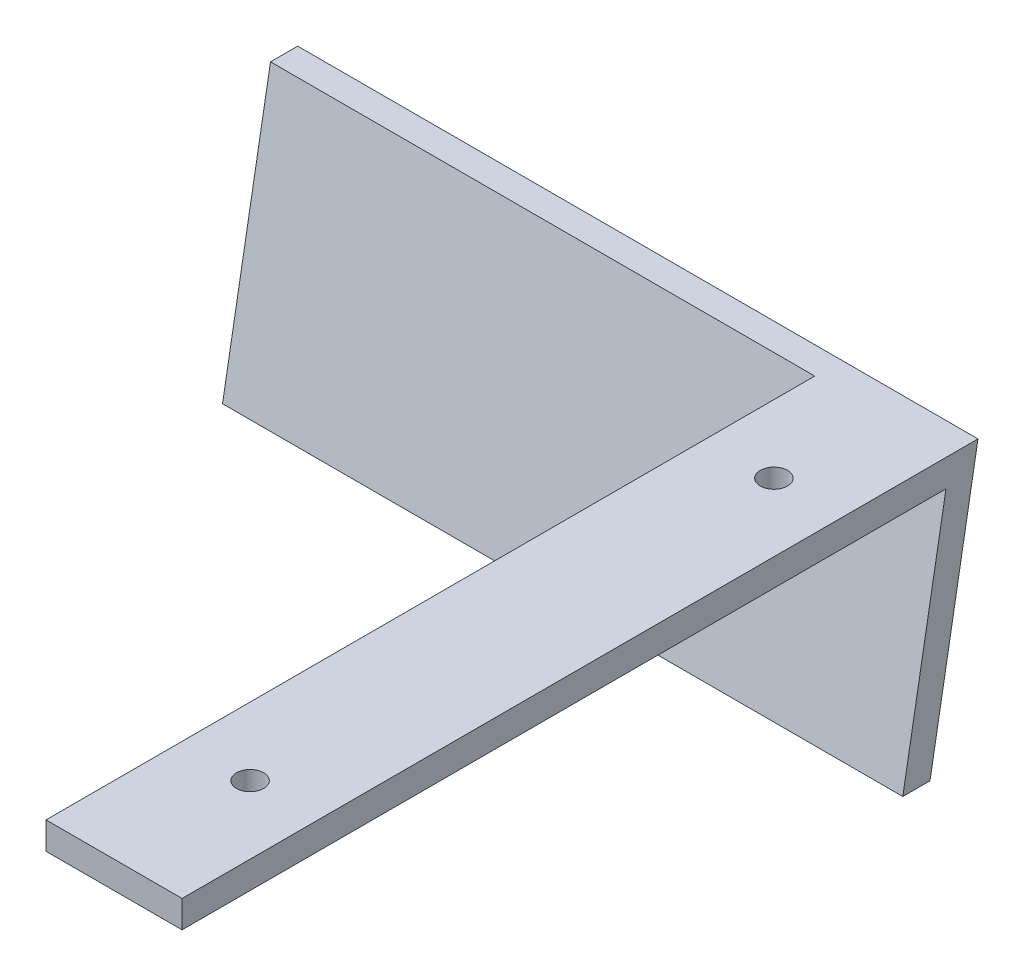
ISO-10303-21;
HEADER;
FILE_DESCRIPTION(('STEP AP214'),'2;1');
FILE_NAME('part.step','',(''),(''),'','','');
FILE_SCHEMA(('AUTOMOTIVE_DESIGN { 1 0 10303 214 1 1 1 1 }'));
ENDSEC;
DATA;
#1=APPLICATION_CONTEXT('core data for automotive mechanical design processes');
#2=APPLICATION_PROTOCOL_DEFINITION('international standard','automotive_design',2000,#1);
#3=PRODUCT_CONTEXT('',#1,'mechanical');
#4=PRODUCT('Part','Part','',(#3));
#5=PRODUCT_RELATED_PRODUCT_CATEGORY('part','',(#4));
#6=PRODUCT_DEFINITION_FORMATION('','',#4);
#7=PRODUCT_DEFINITION_CONTEXT('part definition',#1,'design');
#8=PRODUCT_DEFINITION('design','',#6,#7);
#9=PRODUCT_DEFINITION_SHAPE('','',#8);
#10=(LENGTH_UNIT() NAMED_UNIT(*) SI_UNIT(.MILLI.,.METRE.));
#11=(NAMED_UNIT(*) PLANE_ANGLE_UNIT() SI_UNIT($,.RADIAN.));
#12=(NAMED_UNIT(*) SI_UNIT($,.STERADIAN.) SOLID_ANGLE_UNIT());
#13=UNCERTAINTY_MEASURE_WITH_UNIT(LENGTH_MEASURE(1.E-05),#10,'distance_accuracy_value','');
#14=(GEOMETRIC_REPRESENTATION_CONTEXT(3) GLOBAL_UNCERTAINTY_ASSIGNED_CONTEXT((#13)) GLOBAL_UNIT_ASSIGNED_CONTEXT((#10,
#11,#12)) REPRESENTATION_CONTEXT('',''));
#15=CARTESIAN_POINT('',(0.,0.,0.));
#16=DIRECTION('',(0.,0.,1.));
#17=DIRECTION('',(1.,0.,0.));
#18=AXIS2_PLACEMENT_3D('',#15,#16,#17);
#19=CARTESIAN_POINT('',(-10.,18.,0.));
#20=DIRECTION('',(0.,-1.,0.));
#21=DIRECTION('',(0.,0.,-1.));
#22=AXIS2_PLACEMENT_3D('',#19,#20,#21);
#23=PLANE('',#22);
#24=CARTESIAN_POINT('',(-5.,18.,42.9734603858306));
#25=DIRECTION('',(0.,1.,0.));
#26=DIRECTION('',(0.,0.,-1.));
#27=AXIS2_PLACEMENT_3D('',#24,#25,#26);
#28=CIRCLE('',#27,1.);
#29=CARTESIAN_POINT('',(-5.,18.,41.9734603858306));
#30=VERTEX_POINT('',#29);
#31=EDGE_CURVE('E136',#30,#30,#28,.T.);
#32=ORIENTED_EDGE('',*,*,#31,.T.);
#33=EDGE_LOOP('',(#32));
#34=FACE_BOUND('',#33,.T.);
#35=CARTESIAN_POINT('',(-5.,18.,4.47346038583062));
#36=DIRECTION('',(0.,1.,0.));
#37=DIRECTION('',(0.,0.,-1.));
#38=AXIS2_PLACEMENT_3D('',#35,#36,#37);
#39=CIRCLE('',#38,1.);
#40=CARTESIAN_POINT('',(-5.,18.,3.47346038583062));
#41=VERTEX_POINT('',#40);
#42=EDGE_CURVE('E195',#41,#41,#39,.T.);
#43=ORIENTED_EDGE('',*,*,#42,.T.);
#44=EDGE_LOOP('',(#43));
#45=FACE_BOUND('',#44,.T.);
#46=DIRECTION('',(0.,0.,1.));
#47=VECTOR('',#46,1.);
#48=CARTESIAN_POINT('',(0.,18.,0.));
#49=LINE('',#48,#47);
#50=CARTESIAN_POINT('',(0.,18.,-3.17388565275244));
#51=VERTEX_POINT('',#50);
#52=CARTESIAN_POINT('',(0.,18.,52.9734603858306));
#53=VERTEX_POINT('',#52);
#54=EDGE_CURVE('E124',#51,#53,#49,.T.);
#55=ORIENTED_EDGE('',*,*,#54,.T.);
#56=DIRECTION('',(1.,0.,0.));
#57=VECTOR('',#56,1.);
#58=CARTESIAN_POINT('',(-10.,18.,52.9734603858306));
#59=LINE('',#58,#57);
#60=CARTESIAN_POINT('',(-10.,18.,52.9734603858306));
#61=VERTEX_POINT('',#60);
#62=EDGE_CURVE('E156',#61,#53,#59,.T.);
#63=ORIENTED_EDGE('',*,*,#62,.F.);
#64=DIRECTION('',(0.,0.,1.));
#65=VECTOR('',#64,1.);
#66=CARTESIAN_POINT('',(-10.,18.,0.));
#67=LINE('',#66,#65);
#68=CARTESIAN_POINT('',(-10.,18.,-3.17388565275244));
#69=VERTEX_POINT('',#68);
#70=EDGE_CURVE('E150',#69,#61,#67,.T.);
#71=ORIENTED_EDGE('',*,*,#70,.F.);
#72=DIRECTION('',(1.,0.,0.));
#73=VECTOR('',#72,1.);
#74=CARTESIAN_POINT('',(-10.,18.,-3.17388565275244));
#75=LINE('',#74,#73);
#76=EDGE_CURVE('E11',#69,#51,#75,.T.);
#77=ORIENTED_EDGE('',*,*,#76,.T.);
#78=EDGE_LOOP('',(#55,#63,#71,#77));
#79=FACE_BOUND('',#78,.T.);
#80=ADVANCED_FACE('F43',(#34,#45,#79),#23,.T.);
#81=CARTESIAN_POINT('',(-10.,20.,0.));
#82=DIRECTION('',(0.,1.,0.));
#83=DIRECTION('',(0.,0.,1.));
#84=AXIS2_PLACEMENT_3D('',#81,#82,#83);
#85=PLANE('',#84);
#86=CARTESIAN_POINT('',(-5.,20.,42.9734603858306));
#87=DIRECTION('',(0.,-1.,0.));
#88=DIRECTION('',(0.,0.,1.));
#89=AXIS2_PLACEMENT_3D('',#86,#87,#88);
#90=CIRCLE('',#89,1.);
#91=CARTESIAN_POINT('',(-5.,20.,43.9734603858306));
#92=VERTEX_POINT('',#91);
#93=EDGE_CURVE('E275',#92,#92,#90,.T.);
#94=ORIENTED_EDGE('',*,*,#93,.T.);
#95=EDGE_LOOP('',(#94));
#96=FACE_BOUND('',#95,.T.);
#97=CARTESIAN_POINT('',(-5.,20.,4.47346038583062));
#98=DIRECTION('',(0.,-1.,0.));
#99=DIRECTION('',(0.,0.,1.));
#100=AXIS2_PLACEMENT_3D('',#97,#98,#99);
#101=CIRCLE('',#100,1.);
#102=CARTESIAN_POINT('',(-5.,20.,5.47346038583062));
#103=VERTEX_POINT('',#102);
#104=EDGE_CURVE('E276',#103,#103,#101,.T.);
#105=ORIENTED_EDGE('',*,*,#104,.T.);
#106=EDGE_LOOP('',(#105));
#107=FACE_BOUND('',#106,.T.);
#108=DIRECTION('',(0.,0.,-1.));
#109=VECTOR('',#108,1.);
#110=CARTESIAN_POINT('',(0.,20.,0.));
#111=LINE('',#110,#109);
#112=CARTESIAN_POINT('',(0.,20.,52.9734603858306));
#113=VERTEX_POINT('',#112);
#114=CARTESIAN_POINT('',(0.,20.,-5.52653961416938));
#115=VERTEX_POINT('',#114);
#116=EDGE_CURVE('E159',#113,#115,#111,.T.);
#117=ORIENTED_EDGE('',*,*,#116,.T.);
#118=DIRECTION('',(1.,0.,0.));
#119=VECTOR('',#118,1.);
#120=CARTESIAN_POINT('',(-50.,20.,-5.52653961416938));
#121=LINE('',#120,#119);
#122=CARTESIAN_POINT('',(-50.,20.,-5.52653961416938));
#123=VERTEX_POINT('',#122);
#124=EDGE_CURVE('E146',#123,#115,#121,.T.);
#125=ORIENTED_EDGE('',*,*,#124,.F.);
#126=DIRECTION('',(0.,0.,-1.));
#127=VECTOR('',#126,1.);
#128=CARTESIAN_POINT('',(-50.,20.,0.));
#129=LINE('',#128,#127);
#130=CARTESIAN_POINT('',(-50.,20.,-3.52653961416938));
#131=VERTEX_POINT('',#130);
#132=EDGE_CURVE('E140',#131,#123,#129,.T.);
#133=ORIENTED_EDGE('',*,*,#132,.F.);
#134=DIRECTION('',(1.,0.,0.));
#135=VECTOR('',#134,1.);
#136=CARTESIAN_POINT('',(-50.,20.,-3.52653961416938));
#137=LINE('',#136,#135);
#138=CARTESIAN_POINT('',(-10.,20.,-3.52653961416938));
#139=VERTEX_POINT('',#138);
#140=EDGE_CURVE('E129',#131,#139,#137,.T.);
#141=ORIENTED_EDGE('',*,*,#140,.T.);
#142=DIRECTION('',(0.,0.,-1.));
#143=VECTOR('',#142,1.);
#144=CARTESIAN_POINT('',(-10.,20.,0.));
#145=LINE('',#144,#143);
#146=CARTESIAN_POINT('',(-10.,20.,52.9734603858306));
#147=VERTEX_POINT('',#146);
#148=EDGE_CURVE('E153',#147,#139,#145,.T.);
#149=ORIENTED_EDGE('',*,*,#148,.F.);
#150=DIRECTION('',(1.,0.,0.));
#151=VECTOR('',#150,1.);
#152=CARTESIAN_POINT('',(-10.,20.,52.9734603858306));
#153=LINE('',#152,#151);
#154=EDGE_CURVE('E51',#147,#113,#153,.T.);
#155=ORIENTED_EDGE('',*,*,#154,.T.);
#156=EDGE_LOOP('',(#117,#125,#133,#141,#149,#155));
#157=FACE_BOUND('',#156,.T.);
#158=ADVANCED_FACE('F165',(#96,#107,#157),#85,.T.);
#159=CARTESIAN_POINT('',(-10.,0.,52.9734603858306));
#160=DIRECTION('',(0.,0.,1.));
#161=DIRECTION('',(-1.,0.,0.));
#162=AXIS2_PLACEMENT_3D('',#159,#160,#161);
#163=PLANE('',#162);
#164=DIRECTION('',(0.,1.,0.));
#165=VECTOR('',#164,1.);
#166=CARTESIAN_POINT('',(0.,0.,52.9734603858306));
#167=LINE('',#166,#165);
#168=EDGE_CURVE('E71',#53,#113,#167,.T.);
#169=ORIENTED_EDGE('',*,*,#168,.T.);
#170=ORIENTED_EDGE('',*,*,#154,.F.);
#171=DIRECTION('',(0.,1.,0.));
#172=VECTOR('',#171,1.);
#173=CARTESIAN_POINT('',(-10.,0.,52.9734603858306));
#174=LINE('',#173,#172);
#175=EDGE_CURVE('E59',#61,#147,#174,.T.);
#176=ORIENTED_EDGE('',*,*,#175,.F.);
#177=ORIENTED_EDGE('',*,*,#62,.T.);
#178=EDGE_LOOP('',(#169,#170,#176,#177));
#179=FACE_BOUND('',#178,.T.);
#180=ADVANCED_FACE('F187',(#179),#163,.T.);
#181=CARTESIAN_POINT('',(-10.,0.,0.));
#182=DIRECTION('',(-1.,0.,0.));
#183=DIRECTION('',(0.,0.,-1.));
#184=AXIS2_PLACEMENT_3D('',#181,#182,#183);
#185=PLANE('',#184);
#186=ORIENTED_EDGE('',*,*,#70,.T.);
#187=ORIENTED_EDGE('',*,*,#175,.T.);
#188=ORIENTED_EDGE('',*,*,#148,.T.);
#189=DIRECTION('',(0.,0.984807753012207,-0.173648177666934));
#190=VECTOR('',#189,1.);
#191=CARTESIAN_POINT('',(-10.,0.,0.));
#192=LINE('',#191,#190);
#193=EDGE_CURVE('E82',#69,#139,#192,.T.);
#194=ORIENTED_EDGE('',*,*,#193,.F.);
#195=EDGE_LOOP('',(#186,#187,#188,#194));
#196=FACE_BOUND('',#195,.T.);
#197=ADVANCED_FACE('F198',(#196),#185,.T.);
#198=CARTESIAN_POINT('',(0.,0.,0.));
#199=DIRECTION('',(-1.,0.,0.));
#200=DIRECTION('',(0.,0.,-1.));
#201=AXIS2_PLACEMENT_3D('',#198,#199,#200);
#202=PLANE('',#201);
#203=ORIENTED_EDGE('',*,*,#54,.F.);
#204=DIRECTION('',(0.,0.984807753012207,-0.173648177666934));
#205=VECTOR('',#204,1.);
#206=CARTESIAN_POINT('',(0.,0.,0.));
#207=LINE('',#206,#205);
#208=CARTESIAN_POINT('',(0.,0.,0.));
#209=VERTEX_POINT('',#208);
#210=EDGE_CURVE('E142',#209,#51,#207,.T.);
#211=ORIENTED_EDGE('',*,*,#210,.F.);
#212=DIRECTION('',(0.,0.,1.));
#213=VECTOR('',#212,1.);
#214=CARTESIAN_POINT('',(0.,0.,0.));
#215=LINE('',#214,#213);
#216=CARTESIAN_POINT('',(0.,0.,-2.));
#217=VERTEX_POINT('',#216);
#218=EDGE_CURVE('E121',#217,#209,#215,.T.);
#219=ORIENTED_EDGE('',*,*,#218,.F.);
#220=DIRECTION('',(0.,-0.984807753012208,0.173648177666934));
#221=VECTOR('',#220,1.);
#222=CARTESIAN_POINT('',(0.,-0.342020143325676,-1.93969262078591));
#223=LINE('',#222,#221);
#224=EDGE_CURVE('E131',#115,#217,#223,.T.);
#225=ORIENTED_EDGE('',*,*,#224,.F.);
#226=ORIENTED_EDGE('',*,*,#116,.F.);
#227=ORIENTED_EDGE('',*,*,#168,.F.);
#228=EDGE_LOOP('',(#203,#211,#219,#225,#226,#227));
#229=FACE_BOUND('',#228,.T.);
#230=ADVANCED_FACE('F167',(#229),#202,.F.);
#231=CARTESIAN_POINT('',(-50.,0.,0.));
#232=DIRECTION('',(0.,0.173648177666934,0.984807753012207));
#233=DIRECTION('',(0.,-0.984807753012207,0.173648177666934));
#234=AXIS2_PLACEMENT_3D('',#231,#232,#233);
#235=PLANE('',#234);
#236=ORIENTED_EDGE('',*,*,#193,.T.);
#237=ORIENTED_EDGE('',*,*,#140,.F.);
#238=DIRECTION('',(0.,0.984807753012207,-0.173648177666934));
#239=VECTOR('',#238,1.);
#240=CARTESIAN_POINT('',(-50.,0.,0.));
#241=LINE('',#240,#239);
#242=CARTESIAN_POINT('',(-50.,0.,0.));
#243=VERTEX_POINT('',#242);
#244=EDGE_CURVE('E111',#243,#131,#241,.T.);
#245=ORIENTED_EDGE('',*,*,#244,.F.);
#246=DIRECTION('',(1.,0.,0.));
#247=VECTOR('',#246,1.);
#248=CARTESIAN_POINT('',(-50.,0.,0.));
#249=LINE('',#248,#247);
#250=EDGE_CURVE('E118',#243,#209,#249,.T.);
#251=ORIENTED_EDGE('',*,*,#250,.T.);
#252=ORIENTED_EDGE('',*,*,#210,.T.);
#253=ORIENTED_EDGE('',*,*,#76,.F.);
#254=EDGE_LOOP('',(#236,#237,#245,#251,#252,#253));
#255=FACE_BOUND('',#254,.T.);
#256=ADVANCED_FACE('F127',(#255),#235,.T.);
#257=CARTESIAN_POINT('',(-50.,0.,0.));
#258=DIRECTION('',(0.,-1.,0.));
#259=DIRECTION('',(0.,0.,-1.));
#260=AXIS2_PLACEMENT_3D('',#257,#258,#259);
#261=PLANE('',#260);
#262=ORIENTED_EDGE('',*,*,#218,.T.);
#263=ORIENTED_EDGE('',*,*,#250,.F.);
#264=DIRECTION('',(0.,0.,1.));
#265=VECTOR('',#264,1.);
#266=CARTESIAN_POINT('',(-50.,0.,0.));
#267=LINE('',#266,#265);
#268=CARTESIAN_POINT('',(-50.,0.,-2.));
#269=VERTEX_POINT('',#268);
#270=EDGE_CURVE('E106',#269,#243,#267,.T.);
#271=ORIENTED_EDGE('',*,*,#270,.F.);
#272=DIRECTION('',(1.,0.,0.));
#273=VECTOR('',#272,1.);
#274=CARTESIAN_POINT('',(-50.,0.,-2.));
#275=LINE('',#274,#273);
#276=EDGE_CURVE('E125',#269,#217,#275,.T.);
#277=ORIENTED_EDGE('',*,*,#276,.T.);
#278=EDGE_LOOP('',(#262,#263,#271,#277));
#279=FACE_BOUND('',#278,.T.);
#280=ADVANCED_FACE('F119',(#279),#261,.T.);
#281=CARTESIAN_POINT('',(-50.,-0.342020143325676,-1.93969262078591));
#282=DIRECTION('',(0.,-0.173648177666934,-0.984807753012207));
#283=DIRECTION('',(0.,0.984807753012207,-0.173648177666934));
#284=AXIS2_PLACEMENT_3D('',#281,#282,#283);
#285=PLANE('',#284);
#286=ORIENTED_EDGE('',*,*,#224,.T.);
#287=ORIENTED_EDGE('',*,*,#276,.F.);
#288=DIRECTION('',(0.,-0.984807753012208,0.173648177666934));
#289=VECTOR('',#288,1.);
#290=CARTESIAN_POINT('',(-50.,-0.342020143325676,-1.93969262078591));
#291=LINE('',#290,#289);
#292=EDGE_CURVE('E113',#123,#269,#291,.T.);
#293=ORIENTED_EDGE('',*,*,#292,.F.);
#294=ORIENTED_EDGE('',*,*,#124,.T.);
#295=EDGE_LOOP('',(#286,#287,#293,#294));
#296=FACE_BOUND('',#295,.T.);
#297=ADVANCED_FACE('F169',(#296),#285,.T.);
#298=CARTESIAN_POINT('',(-50.,0.,0.));
#299=DIRECTION('',(-1.,0.,0.));
#300=DIRECTION('',(0.,0.,-1.));
#301=AXIS2_PLACEMENT_3D('',#298,#299,#300);
#302=PLANE('',#301);
#303=ORIENTED_EDGE('',*,*,#244,.T.);
#304=ORIENTED_EDGE('',*,*,#132,.T.);
#305=ORIENTED_EDGE('',*,*,#292,.T.);
#306=ORIENTED_EDGE('',*,*,#270,.T.);
#307=EDGE_LOOP('',(#303,#304,#305,#306));
#308=FACE_BOUND('',#307,.T.);
#309=ADVANCED_FACE('F108',(#308),#302,.T.);
#310=CARTESIAN_POINT('',(-5.,-30.,4.47346038583062));
#311=DIRECTION('',(0.,1.,0.));
#312=DIRECTION('',(0.,0.,1.));
#313=AXIS2_PLACEMENT_3D('',#310,#311,#312);
#314=CYLINDRICAL_SURFACE('',#313,1.);
#315=ORIENTED_EDGE('',*,*,#42,.F.);
#316=EDGE_LOOP('',(#315));
#317=FACE_BOUND('',#316,.T.);
#318=ORIENTED_EDGE('',*,*,#104,.F.);
#319=EDGE_LOOP('',(#318));
#320=FACE_BOUND('',#319,.T.);
#321=ADVANCED_FACE('F177',(#317,#320),#314,.F.);
#322=CARTESIAN_POINT('',(-5.,-30.,42.9734603858306));
#323=DIRECTION('',(0.,1.,0.));
#324=DIRECTION('',(0.,0.,1.));
#325=AXIS2_PLACEMENT_3D('',#322,#323,#324);
#326=CYLINDRICAL_SURFACE('',#325,1.);
#327=ORIENTED_EDGE('',*,*,#31,.F.);
#328=EDGE_LOOP('',(#327));
#329=FACE_BOUND('',#328,.T.);
#330=ORIENTED_EDGE('',*,*,#93,.F.);
#331=EDGE_LOOP('',(#330));
#332=FACE_BOUND('',#331,.T.);
#333=ADVANCED_FACE('F258',(#329,#332),#326,.F.);
#334=CLOSED_SHELL('',(#80,#158,#180,#197,#230,#256,#280,#297,#309,#321,#333));
#335=MANIFOLD_SOLID_BREP('B2',#334);
#336=ADVANCED_BREP_SHAPE_REPRESENTATION('',(#18,#335),#14);
#337=SHAPE_DEFINITION_REPRESENTATION(#9,#336);
ENDSEC;
END-ISO-10303-21;
